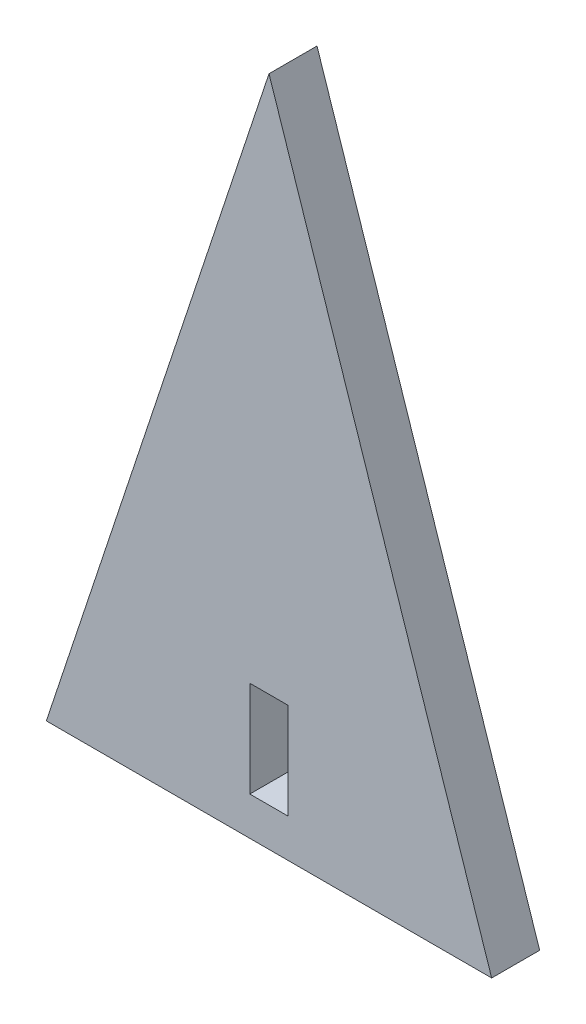
ISO-10303-21;
HEADER;
FILE_DESCRIPTION(('STEP AP214'),'2;1');
FILE_NAME('part.step','',(''),(''),'','','');
FILE_SCHEMA(('AUTOMOTIVE_DESIGN { 1 0 10303 214 1 1 1 1 }'));
ENDSEC;
DATA;
#1=APPLICATION_CONTEXT('core data for automotive mechanical design processes');
#2=APPLICATION_PROTOCOL_DEFINITION('international standard','automotive_design',2000,#1);
#3=PRODUCT_CONTEXT('',#1,'mechanical');
#4=PRODUCT('Part','Part','',(#3));
#5=PRODUCT_RELATED_PRODUCT_CATEGORY('part','',(#4));
#6=PRODUCT_DEFINITION_FORMATION('','',#4);
#7=PRODUCT_DEFINITION_CONTEXT('part definition',#1,'design');
#8=PRODUCT_DEFINITION('design','',#6,#7);
#9=PRODUCT_DEFINITION_SHAPE('','',#8);
#10=(LENGTH_UNIT() NAMED_UNIT(*) SI_UNIT(.MILLI.,.METRE.));
#11=(NAMED_UNIT(*) PLANE_ANGLE_UNIT() SI_UNIT($,.RADIAN.));
#12=(NAMED_UNIT(*) SI_UNIT($,.STERADIAN.) SOLID_ANGLE_UNIT());
#13=UNCERTAINTY_MEASURE_WITH_UNIT(LENGTH_MEASURE(1.E-05),#10,'distance_accuracy_value','');
#14=(GEOMETRIC_REPRESENTATION_CONTEXT(3) GLOBAL_UNCERTAINTY_ASSIGNED_CONTEXT((#13)) GLOBAL_UNIT_ASSIGNED_CONTEXT((#10,
#11,#12)) REPRESENTATION_CONTEXT('',''));
#15=CARTESIAN_POINT('',(0.,0.,0.));
#16=DIRECTION('',(0.,0.,1.));
#17=DIRECTION('',(1.,0.,0.));
#18=AXIS2_PLACEMENT_3D('',#15,#16,#17);
#19=CARTESIAN_POINT('',(0.,0.,3.175));
#20=DIRECTION('',(0.,0.,-1.));
#21=DIRECTION('',(-1.,0.,0.));
#22=AXIS2_PLACEMENT_3D('',#19,#20,#21);
#23=PLANE('',#22);
#24=DIRECTION('',(1.,0.,0.));
#25=VECTOR('',#24,1.);
#26=CARTESIAN_POINT('',(-16.0846255971627,-40.3688020775263,3.175));
#27=LINE('',#26,#25);
#28=CARTESIAN_POINT('',(-16.0846255971627,-40.3688020775263,3.175));
#29=VERTEX_POINT('',#28);
#30=CARTESIAN_POINT('',(13.3793744028373,-40.3688020775263,3.175));
#31=VERTEX_POINT('',#30);
#32=EDGE_CURVE('E134',#29,#31,#27,.T.);
#33=ORIENTED_EDGE('',*,*,#32,.T.);
#34=DIRECTION('',(-0.314600059139954,0.94922431637055,0.));
#35=VECTOR('',#34,1.);
#36=CARTESIAN_POINT('',(-1.35262559716273,4.08119792247373,3.175));
#37=LINE('',#36,#35);
#38=CARTESIAN_POINT('',(-1.35262559716273,4.08119792247373,3.175));
#39=VERTEX_POINT('',#38);
#40=EDGE_CURVE('E137',#31,#39,#37,.T.);
#41=ORIENTED_EDGE('',*,*,#40,.T.);
#42=DIRECTION('',(-0.314600059139954,-0.94922431637055,0.));
#43=VECTOR('',#42,1.);
#44=CARTESIAN_POINT('',(-16.0846255971627,-40.3688020775263,3.175));
#45=LINE('',#44,#43);
#46=EDGE_CURVE('E140',#39,#29,#45,.T.);
#47=ORIENTED_EDGE('',*,*,#46,.T.);
#48=EDGE_LOOP('',(#33,#41,#47));
#49=FACE_BOUND('',#48,.T.);
#50=DIRECTION('',(0.,-1.,0.));
#51=VECTOR('',#50,1.);
#52=CARTESIAN_POINT('',(-2.62262559716273,-37.8288020775263,3.175));
#53=LINE('',#52,#51);
#54=CARTESIAN_POINT('',(-2.62262559716272,-31.4788020775263,3.175));
#55=VERTEX_POINT('',#54);
#56=CARTESIAN_POINT('',(-2.62262559716273,-37.8288020775263,3.175));
#57=VERTEX_POINT('',#56);
#58=EDGE_CURVE('E98',#55,#57,#53,.T.);
#59=ORIENTED_EDGE('',*,*,#58,.F.);
#60=DIRECTION('',(-1.,0.,0.));
#61=VECTOR('',#60,1.);
#62=CARTESIAN_POINT('',(-2.62262559716272,-31.4788020775263,3.175));
#63=LINE('',#62,#61);
#64=CARTESIAN_POINT('',(-0.0826255971627153,-31.4788020775263,3.175));
#65=VERTEX_POINT('',#64);
#66=EDGE_CURVE('E120',#65,#55,#63,.T.);
#67=ORIENTED_EDGE('',*,*,#66,.F.);
#68=DIRECTION('',(0.,1.,0.));
#69=VECTOR('',#68,1.);
#70=CARTESIAN_POINT('',(-0.0826255971627266,-37.8288020775263,3.175));
#71=LINE('',#70,#69);
#72=CARTESIAN_POINT('',(-0.0826255971627266,-37.8288020775263,3.175));
#73=VERTEX_POINT('',#72);
#74=EDGE_CURVE('E118',#73,#65,#71,.T.);
#75=ORIENTED_EDGE('',*,*,#74,.F.);
#76=DIRECTION('',(1.,0.,0.));
#77=VECTOR('',#76,1.);
#78=CARTESIAN_POINT('',(-2.62262559716273,-37.8288020775263,3.175));
#79=LINE('',#78,#77);
#80=EDGE_CURVE('E106',#57,#73,#79,.T.);
#81=ORIENTED_EDGE('',*,*,#80,.F.);
#82=EDGE_LOOP('',(#59,#67,#75,#81));
#83=FACE_BOUND('',#82,.T.);
#84=ADVANCED_FACE('F39',(#49,#83),#23,.F.);
#85=CARTESIAN_POINT('',(0.,0.,0.));
#86=DIRECTION('',(0.,0.,-1.));
#87=DIRECTION('',(-1.,0.,0.));
#88=AXIS2_PLACEMENT_3D('',#85,#86,#87);
#89=PLANE('',#88);
#90=DIRECTION('',(1.,0.,0.));
#91=VECTOR('',#90,1.);
#92=CARTESIAN_POINT('',(-16.0846255971627,-40.3688020775263,0.));
#93=LINE('',#92,#91);
#94=CARTESIAN_POINT('',(-16.0846255971627,-40.3688020775263,0.));
#95=VERTEX_POINT('',#94);
#96=CARTESIAN_POINT('',(13.3793744028373,-40.3688020775263,0.));
#97=VERTEX_POINT('',#96);
#98=EDGE_CURVE('E114',#95,#97,#93,.T.);
#99=ORIENTED_EDGE('',*,*,#98,.F.);
#100=DIRECTION('',(-0.314600059139954,-0.94922431637055,0.));
#101=VECTOR('',#100,1.);
#102=CARTESIAN_POINT('',(-16.0846255971627,-40.3688020775263,0.));
#103=LINE('',#102,#101);
#104=CARTESIAN_POINT('',(-1.35262559716273,4.08119792247373,0.));
#105=VERTEX_POINT('',#104);
#106=EDGE_CURVE('E138',#105,#95,#103,.T.);
#107=ORIENTED_EDGE('',*,*,#106,.F.);
#108=DIRECTION('',(-0.314600059139954,0.94922431637055,0.));
#109=VECTOR('',#108,1.);
#110=CARTESIAN_POINT('',(-1.35262559716273,4.08119792247373,0.));
#111=LINE('',#110,#109);
#112=EDGE_CURVE('E145',#97,#105,#111,.T.);
#113=ORIENTED_EDGE('',*,*,#112,.F.);
#114=EDGE_LOOP('',(#99,#107,#113));
#115=FACE_BOUND('',#114,.T.);
#116=DIRECTION('',(-1.,0.,0.));
#117=VECTOR('',#116,1.);
#118=CARTESIAN_POINT('',(-2.62262559716272,-31.4788020775263,0.));
#119=LINE('',#118,#117);
#120=CARTESIAN_POINT('',(-0.0826255971627153,-31.4788020775263,0.));
#121=VERTEX_POINT('',#120);
#122=CARTESIAN_POINT('',(-2.62262559716272,-31.4788020775263,0.));
#123=VERTEX_POINT('',#122);
#124=EDGE_CURVE('E107',#121,#123,#119,.T.);
#125=ORIENTED_EDGE('',*,*,#124,.T.);
#126=DIRECTION('',(0.,-1.,0.));
#127=VECTOR('',#126,1.);
#128=CARTESIAN_POINT('',(-2.62262559716273,-37.8288020775263,0.));
#129=LINE('',#128,#127);
#130=CARTESIAN_POINT('',(-2.62262559716273,-37.8288020775263,0.));
#131=VERTEX_POINT('',#130);
#132=EDGE_CURVE('E62',#123,#131,#129,.T.);
#133=ORIENTED_EDGE('',*,*,#132,.T.);
#134=DIRECTION('',(1.,0.,0.));
#135=VECTOR('',#134,1.);
#136=CARTESIAN_POINT('',(-2.62262559716273,-37.8288020775263,0.));
#137=LINE('',#136,#135);
#138=CARTESIAN_POINT('',(-0.0826255971627266,-37.8288020775263,0.));
#139=VERTEX_POINT('',#138);
#140=EDGE_CURVE('E113',#131,#139,#137,.T.);
#141=ORIENTED_EDGE('',*,*,#140,.T.);
#142=DIRECTION('',(0.,1.,0.));
#143=VECTOR('',#142,1.);
#144=CARTESIAN_POINT('',(-0.0826255971627266,-37.8288020775263,0.));
#145=LINE('',#144,#143);
#146=EDGE_CURVE('E126',#139,#121,#145,.T.);
#147=ORIENTED_EDGE('',*,*,#146,.T.);
#148=EDGE_LOOP('',(#125,#133,#141,#147));
#149=FACE_BOUND('',#148,.T.);
#150=ADVANCED_FACE('F159',(#115,#149),#89,.T.);
#151=CARTESIAN_POINT('',(-16.0846255971627,-40.3688020775263,3.175));
#152=DIRECTION('',(0.,1.,0.));
#153=DIRECTION('',(0.,0.,1.));
#154=AXIS2_PLACEMENT_3D('',#151,#152,#153);
#155=PLANE('',#154);
#156=ORIENTED_EDGE('',*,*,#98,.T.);
#157=DIRECTION('',(0.,0.,-1.));
#158=VECTOR('',#157,1.);
#159=CARTESIAN_POINT('',(13.3793744028373,-40.3688020775263,3.175));
#160=LINE('',#159,#158);
#161=EDGE_CURVE('E11',#31,#97,#160,.T.);
#162=ORIENTED_EDGE('',*,*,#161,.F.);
#163=ORIENTED_EDGE('',*,*,#32,.F.);
#164=DIRECTION('',(0.,0.,-1.));
#165=VECTOR('',#164,1.);
#166=CARTESIAN_POINT('',(-16.0846255971627,-40.3688020775263,3.175));
#167=LINE('',#166,#165);
#168=EDGE_CURVE('E142',#29,#95,#167,.T.);
#169=ORIENTED_EDGE('',*,*,#168,.T.);
#170=EDGE_LOOP('',(#156,#162,#163,#169));
#171=FACE_BOUND('',#170,.T.);
#172=ADVANCED_FACE('F41',(#171),#155,.F.);
#173=CARTESIAN_POINT('',(-1.35262559716273,4.08119792247373,3.175));
#174=DIRECTION('',(-0.94922431637055,-0.314600059139954,0.));
#175=DIRECTION('',(0.314600059139954,-0.94922431637055,0.));
#176=AXIS2_PLACEMENT_3D('',#173,#174,#175);
#177=PLANE('',#176);
#178=ORIENTED_EDGE('',*,*,#112,.T.);
#179=DIRECTION('',(0.,0.,-1.));
#180=VECTOR('',#179,1.);
#181=CARTESIAN_POINT('',(-1.35262559716273,4.08119792247373,3.175));
#182=LINE('',#181,#180);
#183=EDGE_CURVE('E47',#39,#105,#182,.T.);
#184=ORIENTED_EDGE('',*,*,#183,.F.);
#185=ORIENTED_EDGE('',*,*,#40,.F.);
#186=ORIENTED_EDGE('',*,*,#161,.T.);
#187=EDGE_LOOP('',(#178,#184,#185,#186));
#188=FACE_BOUND('',#187,.T.);
#189=ADVANCED_FACE('F165',(#188),#177,.F.);
#190=CARTESIAN_POINT('',(-16.0846255971627,-40.3688020775263,3.175));
#191=DIRECTION('',(0.94922431637055,-0.314600059139954,0.));
#192=DIRECTION('',(0.314600059139954,0.94922431637055,0.));
#193=AXIS2_PLACEMENT_3D('',#190,#191,#192);
#194=PLANE('',#193);
#195=ORIENTED_EDGE('',*,*,#106,.T.);
#196=ORIENTED_EDGE('',*,*,#168,.F.);
#197=ORIENTED_EDGE('',*,*,#46,.F.);
#198=ORIENTED_EDGE('',*,*,#183,.T.);
#199=EDGE_LOOP('',(#195,#196,#197,#198));
#200=FACE_BOUND('',#199,.T.);
#201=ADVANCED_FACE('F154',(#200),#194,.F.);
#202=CARTESIAN_POINT('',(-2.62262559716273,-37.8288020775263,3.175));
#203=DIRECTION('',(1.,0.,0.));
#204=DIRECTION('',(0.,1.,0.));
#205=AXIS2_PLACEMENT_3D('',#202,#203,#204);
#206=PLANE('',#205);
#207=ORIENTED_EDGE('',*,*,#132,.F.);
#208=DIRECTION('',(0.,0.,-1.));
#209=VECTOR('',#208,1.);
#210=CARTESIAN_POINT('',(-2.62262559716272,-31.4788020775263,3.175));
#211=LINE('',#210,#209);
#212=EDGE_CURVE('E102',#55,#123,#211,.T.);
#213=ORIENTED_EDGE('',*,*,#212,.F.);
#214=ORIENTED_EDGE('',*,*,#58,.T.);
#215=DIRECTION('',(0.,0.,-1.));
#216=VECTOR('',#215,1.);
#217=CARTESIAN_POINT('',(-2.62262559716273,-37.8288020775263,3.175));
#218=LINE('',#217,#216);
#219=EDGE_CURVE('E101',#57,#131,#218,.T.);
#220=ORIENTED_EDGE('',*,*,#219,.T.);
#221=EDGE_LOOP('',(#207,#213,#214,#220));
#222=FACE_BOUND('',#221,.T.);
#223=ADVANCED_FACE('F100',(#222),#206,.T.);
#224=CARTESIAN_POINT('',(-2.62262559716273,-37.8288020775263,3.175));
#225=DIRECTION('',(0.,1.,0.));
#226=DIRECTION('',(0.,0.,1.));
#227=AXIS2_PLACEMENT_3D('',#224,#225,#226);
#228=PLANE('',#227);
#229=ORIENTED_EDGE('',*,*,#140,.F.);
#230=ORIENTED_EDGE('',*,*,#219,.F.);
#231=ORIENTED_EDGE('',*,*,#80,.T.);
#232=DIRECTION('',(0.,0.,-1.));
#233=VECTOR('',#232,1.);
#234=CARTESIAN_POINT('',(-0.0826255971627266,-37.8288020775263,3.175));
#235=LINE('',#234,#233);
#236=EDGE_CURVE('E115',#73,#139,#235,.T.);
#237=ORIENTED_EDGE('',*,*,#236,.T.);
#238=EDGE_LOOP('',(#229,#230,#231,#237));
#239=FACE_BOUND('',#238,.T.);
#240=ADVANCED_FACE('F110',(#239),#228,.T.);
#241=CARTESIAN_POINT('',(-0.0826255971627266,-37.8288020775263,3.175));
#242=DIRECTION('',(-1.,0.,0.));
#243=DIRECTION('',(0.,-1.,0.));
#244=AXIS2_PLACEMENT_3D('',#241,#242,#243);
#245=PLANE('',#244);
#246=ORIENTED_EDGE('',*,*,#146,.F.);
#247=ORIENTED_EDGE('',*,*,#236,.F.);
#248=ORIENTED_EDGE('',*,*,#74,.T.);
#249=DIRECTION('',(0.,0.,-1.));
#250=VECTOR('',#249,1.);
#251=CARTESIAN_POINT('',(-0.0826255971627153,-31.4788020775263,3.175));
#252=LINE('',#251,#250);
#253=EDGE_CURVE('E54',#65,#121,#252,.T.);
#254=ORIENTED_EDGE('',*,*,#253,.T.);
#255=EDGE_LOOP('',(#246,#247,#248,#254));
#256=FACE_BOUND('',#255,.T.);
#257=ADVANCED_FACE('F183',(#256),#245,.T.);
#258=CARTESIAN_POINT('',(-2.62262559716272,-31.4788020775263,3.175));
#259=DIRECTION('',(0.,-1.,0.));
#260=DIRECTION('',(0.,0.,-1.));
#261=AXIS2_PLACEMENT_3D('',#258,#259,#260);
#262=PLANE('',#261);
#263=ORIENTED_EDGE('',*,*,#124,.F.);
#264=ORIENTED_EDGE('',*,*,#253,.F.);
#265=ORIENTED_EDGE('',*,*,#66,.T.);
#266=ORIENTED_EDGE('',*,*,#212,.T.);
#267=EDGE_LOOP('',(#263,#264,#265,#266));
#268=FACE_BOUND('',#267,.T.);
#269=ADVANCED_FACE('F186',(#268),#262,.T.);
#270=CLOSED_SHELL('',(#84,#150,#172,#189,#201,#223,#240,#257,#269));
#271=MANIFOLD_SOLID_BREP('B2',#270);
#272=ADVANCED_BREP_SHAPE_REPRESENTATION('',(#18,#271),#14);
#273=SHAPE_DEFINITION_REPRESENTATION(#9,#272);
ENDSEC;
END-ISO-10303-21;
